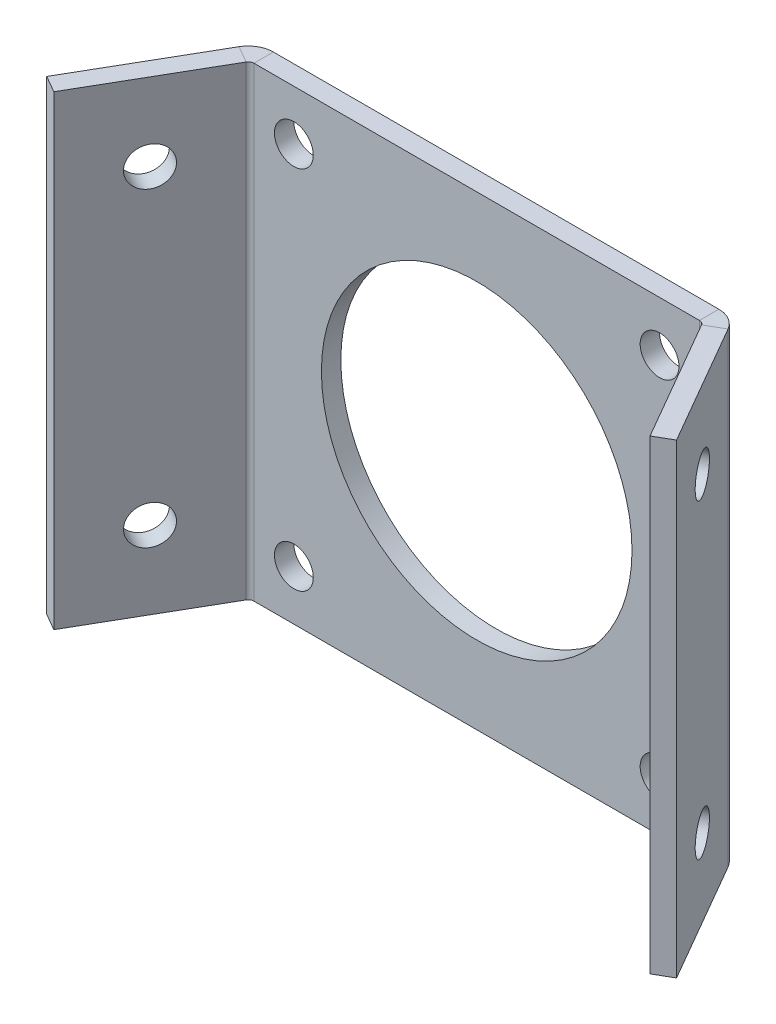
ISO-10303-21;
HEADER;
FILE_DESCRIPTION(('STEP AP214'),'2;1');
FILE_NAME('part.step','',(''),(''),'','','');
FILE_SCHEMA(('AUTOMOTIVE_DESIGN { 1 0 10303 214 1 1 1 1 }'));
ENDSEC;
DATA;
#1=APPLICATION_CONTEXT('core data for automotive mechanical design processes');
#2=APPLICATION_PROTOCOL_DEFINITION('international standard','automotive_design',2000,#1);
#3=PRODUCT_CONTEXT('',#1,'mechanical');
#4=PRODUCT('Part','Part','',(#3));
#5=PRODUCT_RELATED_PRODUCT_CATEGORY('part','',(#4));
#6=PRODUCT_DEFINITION_FORMATION('','',#4);
#7=PRODUCT_DEFINITION_CONTEXT('part definition',#1,'design');
#8=PRODUCT_DEFINITION('design','',#6,#7);
#9=PRODUCT_DEFINITION_SHAPE('','',#8);
#10=(LENGTH_UNIT() NAMED_UNIT(*) SI_UNIT(.MILLI.,.METRE.));
#11=(NAMED_UNIT(*) PLANE_ANGLE_UNIT() SI_UNIT($,.RADIAN.));
#12=(NAMED_UNIT(*) SI_UNIT($,.STERADIAN.) SOLID_ANGLE_UNIT());
#13=UNCERTAINTY_MEASURE_WITH_UNIT(LENGTH_MEASURE(1.E-05),#10,'distance_accuracy_value','');
#14=(GEOMETRIC_REPRESENTATION_CONTEXT(3) GLOBAL_UNCERTAINTY_ASSIGNED_CONTEXT((#13)) GLOBAL_UNIT_ASSIGNED_CONTEXT((#10,
#11,#12)) REPRESENTATION_CONTEXT('',''));
#15=CARTESIAN_POINT('',(0.,0.,0.));
#16=DIRECTION('',(0.,0.,1.));
#17=DIRECTION('',(1.,0.,0.));
#18=AXIS2_PLACEMENT_3D('',#15,#16,#17);
#19=CARTESIAN_POINT('',(0.,0.,-2.5));
#20=DIRECTION('',(0.,0.,1.));
#21=DIRECTION('',(1.,0.,0.));
#22=AXIS2_PLACEMENT_3D('',#19,#20,#21);
#23=PLANE('',#22);
#24=CARTESIAN_POINT('',(23.55,23.55,-2.5));
#25=DIRECTION('',(0.,0.,1.));
#26=DIRECTION('',(1.,0.,0.));
#27=AXIS2_PLACEMENT_3D('',#24,#25,#26);
#28=CIRCLE('',#27,2.5);
#29=CARTESIAN_POINT('',(26.05,23.55,-2.5));
#30=VERTEX_POINT('',#29);
#31=EDGE_CURVE('E336',#30,#30,#28,.T.);
#32=ORIENTED_EDGE('',*,*,#31,.T.);
#33=EDGE_LOOP('',(#32));
#34=FACE_BOUND('',#33,.T.);
#35=CARTESIAN_POINT('',(23.55,-23.55,-2.5));
#36=DIRECTION('',(0.,0.,1.));
#37=DIRECTION('',(1.,0.,0.));
#38=AXIS2_PLACEMENT_3D('',#35,#36,#37);
#39=CIRCLE('',#38,2.5);
#40=CARTESIAN_POINT('',(26.05,-23.55,-2.5));
#41=VERTEX_POINT('',#40);
#42=EDGE_CURVE('E333',#41,#41,#39,.T.);
#43=ORIENTED_EDGE('',*,*,#42,.T.);
#44=EDGE_LOOP('',(#43));
#45=FACE_BOUND('',#44,.T.);
#46=CARTESIAN_POINT('',(-23.55,-23.55,-2.5));
#47=DIRECTION('',(0.,0.,1.));
#48=DIRECTION('',(1.,0.,0.));
#49=AXIS2_PLACEMENT_3D('',#46,#47,#48);
#50=CIRCLE('',#49,2.5);
#51=CARTESIAN_POINT('',(-21.05,-23.55,-2.5));
#52=VERTEX_POINT('',#51);
#53=EDGE_CURVE('E330',#52,#52,#50,.T.);
#54=ORIENTED_EDGE('',*,*,#53,.T.);
#55=EDGE_LOOP('',(#54));
#56=FACE_BOUND('',#55,.T.);
#57=CARTESIAN_POINT('',(0.,0.,-2.5));
#58=DIRECTION('',(0.,0.,1.));
#59=DIRECTION('',(1.,0.,0.));
#60=AXIS2_PLACEMENT_3D('',#57,#58,#59);
#61=CIRCLE('',#60,20.);
#62=CARTESIAN_POINT('',(20.,0.,-2.5));
#63=VERTEX_POINT('',#62);
#64=EDGE_CURVE('E319',#63,#63,#61,.T.);
#65=ORIENTED_EDGE('',*,*,#64,.T.);
#66=EDGE_LOOP('',(#65));
#67=FACE_BOUND('',#66,.T.);
#68=CARTESIAN_POINT('',(-23.55,23.55,-2.5));
#69=DIRECTION('',(0.,0.,1.));
#70=DIRECTION('',(1.,0.,0.));
#71=AXIS2_PLACEMENT_3D('',#68,#69,#70);
#72=CIRCLE('',#71,2.5);
#73=CARTESIAN_POINT('',(-21.05,23.55,-2.5));
#74=VERTEX_POINT('',#73);
#75=EDGE_CURVE('E211',#74,#74,#72,.T.);
#76=ORIENTED_EDGE('',*,*,#75,.T.);
#77=EDGE_LOOP('',(#76));
#78=FACE_BOUND('',#77,.T.);
#79=DIRECTION('',(0.,-1.,0.));
#80=VECTOR('',#79,1.);
#81=CARTESIAN_POINT('',(-28.6879724457668,-30.,-2.5));
#82=LINE('',#81,#80);
#83=CARTESIAN_POINT('',(-28.6879724457668,-30.,-2.5));
#84=VERTEX_POINT('',#83);
#85=CARTESIAN_POINT('',(-28.6879724457668,30.,-2.5));
#86=VERTEX_POINT('',#85);
#87=EDGE_CURVE('E212',#84,#86,#82,.F.);
#88=ORIENTED_EDGE('',*,*,#87,.T.);
#89=DIRECTION('',(-1.,0.,0.));
#90=VECTOR('',#89,1.);
#91=CARTESIAN_POINT('',(-32.,30.,-2.5));
#92=LINE('',#91,#90);
#93=CARTESIAN_POINT('',(28.6879724457668,30.,-2.5));
#94=VERTEX_POINT('',#93);
#95=EDGE_CURVE('E88',#94,#86,#92,.T.);
#96=ORIENTED_EDGE('',*,*,#95,.F.);
#97=DIRECTION('',(0.,1.,0.));
#98=VECTOR('',#97,1.);
#99=CARTESIAN_POINT('',(28.6879724457668,30.,-2.5));
#100=LINE('',#99,#98);
#101=CARTESIAN_POINT('',(28.6879724457668,-30.,-2.5));
#102=VERTEX_POINT('',#101);
#103=EDGE_CURVE('E265',#94,#102,#100,.F.);
#104=ORIENTED_EDGE('',*,*,#103,.T.);
#105=DIRECTION('',(1.,0.,0.));
#106=VECTOR('',#105,1.);
#107=CARTESIAN_POINT('',(-32.,-30.,-2.5));
#108=LINE('',#107,#106);
#109=EDGE_CURVE('E13',#84,#102,#108,.T.);
#110=ORIENTED_EDGE('',*,*,#109,.F.);
#111=EDGE_LOOP('',(#88,#96,#104,#110));
#112=FACE_BOUND('',#111,.T.);
#113=ADVANCED_FACE('F79',(#34,#45,#56,#67,#78,#112),#23,.F.);
#114=CARTESIAN_POINT('',(0.,0.,0.));
#115=DIRECTION('',(0.,0.,1.));
#116=DIRECTION('',(1.,0.,0.));
#117=AXIS2_PLACEMENT_3D('',#114,#115,#116);
#118=PLANE('',#117);
#119=CARTESIAN_POINT('',(23.55,23.55,0.));
#120=DIRECTION('',(0.,0.,1.));
#121=DIRECTION('',(1.,0.,0.));
#122=AXIS2_PLACEMENT_3D('',#119,#120,#121);
#123=CIRCLE('',#122,2.5);
#124=CARTESIAN_POINT('',(26.05,23.55,0.));
#125=VERTEX_POINT('',#124);
#126=EDGE_CURVE('E316',#125,#125,#123,.T.);
#127=ORIENTED_EDGE('',*,*,#126,.F.);
#128=EDGE_LOOP('',(#127));
#129=FACE_BOUND('',#128,.T.);
#130=CARTESIAN_POINT('',(23.55,-23.55,0.));
#131=DIRECTION('',(0.,0.,1.));
#132=DIRECTION('',(1.,0.,0.));
#133=AXIS2_PLACEMENT_3D('',#130,#131,#132);
#134=CIRCLE('',#133,2.5);
#135=CARTESIAN_POINT('',(26.05,-23.55,0.));
#136=VERTEX_POINT('',#135);
#137=EDGE_CURVE('E320',#136,#136,#134,.T.);
#138=ORIENTED_EDGE('',*,*,#137,.F.);
#139=EDGE_LOOP('',(#138));
#140=FACE_BOUND('',#139,.T.);
#141=CARTESIAN_POINT('',(-23.55,-23.55,0.));
#142=DIRECTION('',(0.,0.,1.));
#143=DIRECTION('',(1.,0.,0.));
#144=AXIS2_PLACEMENT_3D('',#141,#142,#143);
#145=CIRCLE('',#144,2.5);
#146=CARTESIAN_POINT('',(-21.05,-23.55,0.));
#147=VERTEX_POINT('',#146);
#148=EDGE_CURVE('E323',#147,#147,#145,.T.);
#149=ORIENTED_EDGE('',*,*,#148,.F.);
#150=EDGE_LOOP('',(#149));
#151=FACE_BOUND('',#150,.T.);
#152=CARTESIAN_POINT('',(0.,0.,0.));
#153=DIRECTION('',(0.,0.,1.));
#154=DIRECTION('',(1.,0.,0.));
#155=AXIS2_PLACEMENT_3D('',#152,#153,#154);
#156=CIRCLE('',#155,20.);
#157=CARTESIAN_POINT('',(20.,0.,0.));
#158=VERTEX_POINT('',#157);
#159=EDGE_CURVE('E294',#158,#158,#156,.T.);
#160=ORIENTED_EDGE('',*,*,#159,.F.);
#161=EDGE_LOOP('',(#160));
#162=FACE_BOUND('',#161,.T.);
#163=CARTESIAN_POINT('',(-23.55,23.55,0.));
#164=DIRECTION('',(0.,0.,1.));
#165=DIRECTION('',(1.,0.,0.));
#166=AXIS2_PLACEMENT_3D('',#163,#164,#165);
#167=CIRCLE('',#166,2.5);
#168=CARTESIAN_POINT('',(-21.05,23.55,0.));
#169=VERTEX_POINT('',#168);
#170=EDGE_CURVE('E339',#169,#169,#167,.T.);
#171=ORIENTED_EDGE('',*,*,#170,.F.);
#172=EDGE_LOOP('',(#171));
#173=FACE_BOUND('',#172,.T.);
#174=DIRECTION('',(-1.,0.,0.));
#175=VECTOR('',#174,1.);
#176=CARTESIAN_POINT('',(-32.,30.,0.));
#177=LINE('',#176,#175);
#178=CARTESIAN_POINT('',(28.6879724457668,30.,0.));
#179=VERTEX_POINT('',#178);
#180=CARTESIAN_POINT('',(-28.6879724457668,30.,0.));
#181=VERTEX_POINT('',#180);
#182=EDGE_CURVE('E283',#179,#181,#177,.T.);
#183=ORIENTED_EDGE('',*,*,#182,.T.);
#184=DIRECTION('',(0.,-1.,0.));
#185=VECTOR('',#184,1.);
#186=CARTESIAN_POINT('',(-28.6879724457668,-30.,0.));
#187=LINE('',#186,#185);
#188=CARTESIAN_POINT('',(-28.6879724457668,-30.,0.));
#189=VERTEX_POINT('',#188);
#190=EDGE_CURVE('E224',#189,#181,#187,.F.);
#191=ORIENTED_EDGE('',*,*,#190,.F.);
#192=DIRECTION('',(1.,0.,0.));
#193=VECTOR('',#192,1.);
#194=CARTESIAN_POINT('',(-32.,-30.,0.));
#195=LINE('',#194,#193);
#196=CARTESIAN_POINT('',(28.6879724457668,-30.,0.));
#197=VERTEX_POINT('',#196);
#198=EDGE_CURVE('E287',#189,#197,#195,.T.);
#199=ORIENTED_EDGE('',*,*,#198,.T.);
#200=DIRECTION('',(0.,1.,0.));
#201=VECTOR('',#200,1.);
#202=CARTESIAN_POINT('',(28.6879724457668,30.,0.));
#203=LINE('',#202,#201);
#204=EDGE_CURVE('E96',#179,#197,#203,.F.);
#205=ORIENTED_EDGE('',*,*,#204,.F.);
#206=EDGE_LOOP('',(#183,#191,#199,#205));
#207=FACE_BOUND('',#206,.T.);
#208=ADVANCED_FACE('F369',(#129,#140,#151,#162,#173,#207),#118,.T.);
#209=CARTESIAN_POINT('',(-32.,-30.,-2.5));
#210=DIRECTION('',(0.,-1.,0.));
#211=DIRECTION('',(0.,0.,-1.));
#212=AXIS2_PLACEMENT_3D('',#209,#210,#211);
#213=PLANE('',#212);
#214=ORIENTED_EDGE('',*,*,#198,.F.);
#215=DIRECTION('',(0.,0.,-1.));
#216=VECTOR('',#215,1.);
#217=CARTESIAN_POINT('',(-28.6879724457668,-30.,0.));
#218=LINE('',#217,#216);
#219=EDGE_CURVE('E218',#189,#84,#218,.T.);
#220=ORIENTED_EDGE('',*,*,#219,.T.);
#221=ORIENTED_EDGE('',*,*,#109,.T.);
#222=DIRECTION('',(0.,0.,-1.));
#223=VECTOR('',#222,1.);
#224=CARTESIAN_POINT('',(28.6879724457668,-30.,0.));
#225=LINE('',#224,#223);
#226=EDGE_CURVE('E280',#197,#102,#225,.T.);
#227=ORIENTED_EDGE('',*,*,#226,.F.);
#228=EDGE_LOOP('',(#214,#220,#221,#227));
#229=FACE_BOUND('',#228,.T.);
#230=ADVANCED_FACE('F375',(#229),#213,.T.);
#231=CARTESIAN_POINT('',(-32.,30.,-2.5));
#232=DIRECTION('',(0.,1.,0.));
#233=DIRECTION('',(0.,0.,1.));
#234=AXIS2_PLACEMENT_3D('',#231,#232,#233);
#235=PLANE('',#234);
#236=DIRECTION('',(0.,0.,-1.));
#237=VECTOR('',#236,1.);
#238=CARTESIAN_POINT('',(-28.6879724457668,30.,0.));
#239=LINE('',#238,#237);
#240=EDGE_CURVE('E230',#181,#86,#239,.T.);
#241=ORIENTED_EDGE('',*,*,#240,.F.);
#242=ORIENTED_EDGE('',*,*,#182,.F.);
#243=DIRECTION('',(0.,0.,-1.));
#244=VECTOR('',#243,1.);
#245=CARTESIAN_POINT('',(28.6879724457668,30.,0.));
#246=LINE('',#245,#244);
#247=EDGE_CURVE('E271',#179,#94,#246,.T.);
#248=ORIENTED_EDGE('',*,*,#247,.T.);
#249=ORIENTED_EDGE('',*,*,#95,.T.);
#250=EDGE_LOOP('',(#241,#242,#248,#249));
#251=FACE_BOUND('',#250,.T.);
#252=ADVANCED_FACE('F81',(#251),#235,.T.);
#253=CARTESIAN_POINT('',(28.6879724457668,-30.,0.736599999999997));
#254=DIRECTION('',(0.,-1.,0.));
#255=DIRECTION('',(0.,0.,-1.));
#256=AXIS2_PLACEMENT_3D('',#253,#254,#255);
#257=PLANE('',#256);
#258=DIRECTION('',(-0.866025403784436,0.,0.500000000000004));
#259=VECTOR('',#258,1.);
#260=CARTESIAN_POINT('',(31.4909502676555,-30.,-0.881700000000009));
#261=LINE('',#260,#259);
#262=CARTESIAN_POINT('',(29.3258867581944,-30.,0.368299999999995));
#263=VERTEX_POINT('',#262);
#264=CARTESIAN_POINT('',(31.4909502676555,-30.,-0.881700000000012));
#265=VERTEX_POINT('',#264);
#266=EDGE_CURVE('E233',#263,#265,#261,.F.);
#267=ORIENTED_EDGE('',*,*,#266,.F.);
#268=CARTESIAN_POINT('',(28.6879724457668,-30.,0.736599999999997));
#269=DIRECTION('',(0.,1.,0.));
#270=DIRECTION('',(0.,0.,1.));
#271=AXIS2_PLACEMENT_3D('',#268,#269,#270);
#272=CIRCLE('',#271,0.736599999999998);
#273=EDGE_CURVE('E274',#197,#263,#272,.F.);
#274=ORIENTED_EDGE('',*,*,#273,.F.);
#275=ORIENTED_EDGE('',*,*,#226,.T.);
#276=CARTESIAN_POINT('',(28.6879724457668,-30.,0.736599999999997));
#277=DIRECTION('',(0.,1.,0.));
#278=DIRECTION('',(0.,0.,1.));
#279=AXIS2_PLACEMENT_3D('',#276,#277,#278);
#280=CIRCLE('',#279,3.2366);
#281=EDGE_CURVE('E267',#102,#265,#280,.F.);
#282=ORIENTED_EDGE('',*,*,#281,.T.);
#283=EDGE_LOOP('',(#267,#274,#275,#282));
#284=FACE_BOUND('',#283,.T.);
#285=ADVANCED_FACE('F386',(#284),#257,.T.);
#286=CARTESIAN_POINT('',(28.6879724457668,30.,0.736599999999997));
#287=DIRECTION('',(0.,-1.,0.));
#288=DIRECTION('',(0.,0.,-1.));
#289=AXIS2_PLACEMENT_3D('',#286,#287,#288);
#290=PLANE('',#289);
#291=CARTESIAN_POINT('',(28.6879724457668,30.,0.736599999999997));
#292=DIRECTION('',(0.,1.,0.));
#293=DIRECTION('',(0.,0.,1.));
#294=AXIS2_PLACEMENT_3D('',#291,#292,#293);
#295=CIRCLE('',#294,0.736599999999998);
#296=CARTESIAN_POINT('',(29.3258867581944,30.,0.368299999999995));
#297=VERTEX_POINT('',#296);
#298=EDGE_CURVE('E238',#297,#179,#295,.T.);
#299=ORIENTED_EDGE('',*,*,#298,.F.);
#300=DIRECTION('',(-0.866025403784436,0.,0.500000000000004));
#301=VECTOR('',#300,1.);
#302=CARTESIAN_POINT('',(29.3258867581944,30.,0.368300000000002));
#303=LINE('',#302,#301);
#304=CARTESIAN_POINT('',(31.4909502676555,30.,-0.881700000000016));
#305=VERTEX_POINT('',#304);
#306=EDGE_CURVE('E258',#297,#305,#303,.F.);
#307=ORIENTED_EDGE('',*,*,#306,.T.);
#308=CARTESIAN_POINT('',(28.6879724457668,30.,0.736599999999997));
#309=DIRECTION('',(0.,1.,0.));
#310=DIRECTION('',(0.,0.,1.));
#311=AXIS2_PLACEMENT_3D('',#308,#309,#310);
#312=CIRCLE('',#311,3.2366);
#313=EDGE_CURVE('E268',#305,#94,#312,.T.);
#314=ORIENTED_EDGE('',*,*,#313,.T.);
#315=ORIENTED_EDGE('',*,*,#247,.F.);
#316=EDGE_LOOP('',(#299,#307,#314,#315));
#317=FACE_BOUND('',#316,.T.);
#318=ADVANCED_FACE('F380',(#317),#290,.F.);
#319=CARTESIAN_POINT('',(28.6879724457668,30.,0.736599999999997));
#320=DIRECTION('',(0.,1.,0.));
#321=DIRECTION('',(0.866025403784436,0.,-0.500000000000004));
#322=AXIS2_PLACEMENT_3D('',#319,#320,#321);
#323=CYLINDRICAL_SURFACE('',#322,3.2366);
#324=ORIENTED_EDGE('',*,*,#103,.F.);
#325=ORIENTED_EDGE('',*,*,#313,.F.);
#326=DIRECTION('',(0.,1.,0.));
#327=VECTOR('',#326,1.);
#328=CARTESIAN_POINT('',(31.4909502676555,-30.,-0.881700000000015));
#329=LINE('',#328,#327);
#330=EDGE_CURVE('E256',#305,#265,#329,.F.);
#331=ORIENTED_EDGE('',*,*,#330,.T.);
#332=ORIENTED_EDGE('',*,*,#281,.F.);
#333=EDGE_LOOP('',(#324,#325,#331,#332));
#334=FACE_BOUND('',#333,.T.);
#335=ADVANCED_FACE('F402',(#334),#323,.T.);
#336=CARTESIAN_POINT('',(28.6879724457668,30.,0.736599999999997));
#337=DIRECTION('',(0.,1.,0.));
#338=DIRECTION('',(0.866025403784436,0.,-0.500000000000004));
#339=AXIS2_PLACEMENT_3D('',#336,#337,#338);
#340=CYLINDRICAL_SURFACE('',#339,0.736599999999998);
#341=ORIENTED_EDGE('',*,*,#204,.T.);
#342=ORIENTED_EDGE('',*,*,#273,.T.);
#343=DIRECTION('',(0.,1.,0.));
#344=VECTOR('',#343,1.);
#345=CARTESIAN_POINT('',(29.3258867581944,-30.,0.368299999999996));
#346=LINE('',#345,#344);
#347=EDGE_CURVE('E261',#263,#297,#346,.T.);
#348=ORIENTED_EDGE('',*,*,#347,.T.);
#349=ORIENTED_EDGE('',*,*,#298,.T.);
#350=EDGE_LOOP('',(#341,#342,#348,#349));
#351=FACE_BOUND('',#350,.T.);
#352=ADVANCED_FACE('F425',(#351),#340,.F.);
#353=CARTESIAN_POINT('',(31.278312163513,-30.,-1.25000000000001));
#354=DIRECTION('',(0.,1.,0.));
#355=DIRECTION('',(0.,0.,1.));
#356=AXIS2_PLACEMENT_3D('',#353,#354,#355);
#357=PLANE('',#356);
#358=ORIENTED_EDGE('',*,*,#266,.T.);
#359=DIRECTION('',(-0.500000000000004,0.,-0.866025403784436));
#360=VECTOR('',#359,1.);
#361=CARTESIAN_POINT('',(23.2783121635128,-30.,-15.1064064605511));
#362=LINE('',#361,#360);
#363=CARTESIAN_POINT('',(40.556624327026,-30.,14.8205080756887));
#364=VERTEX_POINT('',#363);
#365=EDGE_CURVE('E246',#364,#265,#362,.T.);
#366=ORIENTED_EDGE('',*,*,#365,.F.);
#367=DIRECTION('',(-0.866025403784436,0.,0.500000000000004));
#368=VECTOR('',#367,1.);
#369=CARTESIAN_POINT('',(40.556624327026,-30.,14.8205080756887));
#370=LINE('',#369,#368);
#371=CARTESIAN_POINT('',(38.3915608175649,-30.,16.0705080756887));
#372=VERTEX_POINT('',#371);
#373=EDGE_CURVE('E239',#364,#372,#370,.T.);
#374=ORIENTED_EDGE('',*,*,#373,.T.);
#375=DIRECTION('',(0.500000000000004,0.,0.866025403784436));
#376=VECTOR('',#375,1.);
#377=CARTESIAN_POINT('',(29.1132486540519,-30.,0.));
#378=LINE('',#377,#376);
#379=EDGE_CURVE('E253',#372,#263,#378,.F.);
#380=ORIENTED_EDGE('',*,*,#379,.T.);
#381=EDGE_LOOP('',(#358,#366,#374,#380));
#382=FACE_BOUND('',#381,.T.);
#383=ADVANCED_FACE('F420',(#382),#357,.F.);
#384=CARTESIAN_POINT('',(40.556624327026,30.,14.8205080756887));
#385=DIRECTION('',(0.,-1.,0.));
#386=DIRECTION('',(0.,0.,-1.));
#387=AXIS2_PLACEMENT_3D('',#384,#385,#386);
#388=PLANE('',#387);
#389=ORIENTED_EDGE('',*,*,#306,.F.);
#390=DIRECTION('',(-0.500000000000004,0.,-0.866025403784436));
#391=VECTOR('',#390,1.);
#392=CARTESIAN_POINT('',(38.3915608175649,30.,16.0705080756887));
#393=LINE('',#392,#391);
#394=CARTESIAN_POINT('',(38.3915608175649,30.,16.0705080756887));
#395=VERTEX_POINT('',#394);
#396=EDGE_CURVE('E251',#297,#395,#393,.F.);
#397=ORIENTED_EDGE('',*,*,#396,.T.);
#398=DIRECTION('',(-0.866025403784436,0.,0.500000000000004));
#399=VECTOR('',#398,1.);
#400=CARTESIAN_POINT('',(40.556624327026,30.,14.8205080756887));
#401=LINE('',#400,#399);
#402=CARTESIAN_POINT('',(40.556624327026,30.,14.8205080756887));
#403=VERTEX_POINT('',#402);
#404=EDGE_CURVE('E235',#403,#395,#401,.T.);
#405=ORIENTED_EDGE('',*,*,#404,.F.);
#406=DIRECTION('',(0.500000000000004,0.,0.866025403784436));
#407=VECTOR('',#406,1.);
#408=CARTESIAN_POINT('',(23.2783121635129,30.,-15.1064064605511));
#409=LINE('',#408,#407);
#410=EDGE_CURVE('E244',#305,#403,#409,.T.);
#411=ORIENTED_EDGE('',*,*,#410,.F.);
#412=EDGE_LOOP('',(#389,#397,#405,#411));
#413=FACE_BOUND('',#412,.T.);
#414=ADVANCED_FACE('F412',(#413),#388,.F.);
#415=CARTESIAN_POINT('',(23.2783121635128,0.,-15.1064064605511));
#416=DIRECTION('',(-0.866025403784436,0.,0.500000000000004));
#417=DIRECTION('',(0.500000000000004,0.,0.866025403784436));
#418=AXIS2_PLACEMENT_3D('',#415,#416,#417);
#419=PLANE('',#418);
#420=CARTESIAN_POINT('',(36.0237872973408,-20.,6.96940403784434));
#421=DIRECTION('',(-0.866025403784436,0.,0.500000000000004));
#422=DIRECTION('',(-0.500000000000004,0.,-0.866025403784436));
#423=AXIS2_PLACEMENT_3D('',#420,#421,#422);
#424=CIRCLE('',#423,2.5);
#425=CARTESIAN_POINT('',(34.7737872973408,-20.,4.80434052838325));
#426=VERTEX_POINT('',#425);
#427=EDGE_CURVE('E311',#426,#426,#424,.T.);
#428=ORIENTED_EDGE('',*,*,#427,.T.);
#429=EDGE_LOOP('',(#428));
#430=FACE_BOUND('',#429,.T.);
#431=CARTESIAN_POINT('',(36.0237872973408,20.,6.96940403784434));
#432=DIRECTION('',(-0.866025403784436,0.,0.500000000000004));
#433=DIRECTION('',(0.500000000000004,0.,0.866025403784436));
#434=AXIS2_PLACEMENT_3D('',#431,#432,#433);
#435=CIRCLE('',#434,2.49999999999999);
#436=CARTESIAN_POINT('',(37.2737872973408,20.,9.13446754730543));
#437=VERTEX_POINT('',#436);
#438=EDGE_CURVE('E301',#437,#437,#435,.T.);
#439=ORIENTED_EDGE('',*,*,#438,.T.);
#440=EDGE_LOOP('',(#439));
#441=FACE_BOUND('',#440,.T.);
#442=ORIENTED_EDGE('',*,*,#330,.F.);
#443=ORIENTED_EDGE('',*,*,#410,.T.);
#444=DIRECTION('',(0.,-1.,0.));
#445=VECTOR('',#444,1.);
#446=CARTESIAN_POINT('',(40.556624327026,0.,14.8205080756887));
#447=LINE('',#446,#445);
#448=EDGE_CURVE('E242',#403,#364,#447,.T.);
#449=ORIENTED_EDGE('',*,*,#448,.T.);
#450=ORIENTED_EDGE('',*,*,#365,.T.);
#451=EDGE_LOOP('',(#442,#443,#449,#450));
#452=FACE_BOUND('',#451,.T.);
#453=ADVANCED_FACE('F409',(#430,#441,#452),#419,.F.);
#454=CARTESIAN_POINT('',(21.1132486540517,0.,-13.8564064605511));
#455=DIRECTION('',(-0.866025403784436,0.,0.500000000000004));
#456=DIRECTION('',(0.500000000000004,0.,0.866025403784436));
#457=AXIS2_PLACEMENT_3D('',#454,#455,#456);
#458=PLANE('',#457);
#459=CARTESIAN_POINT('',(33.8587237878797,-20.,8.21940403784437));
#460=DIRECTION('',(-0.866025403784436,0.,0.500000000000004));
#461=DIRECTION('',(0.500000000000004,0.,0.866025403784436));
#462=AXIS2_PLACEMENT_3D('',#459,#460,#461);
#463=CIRCLE('',#462,2.5);
#464=CARTESIAN_POINT('',(35.1087237878797,-20.,10.3844675473055));
#465=VERTEX_POINT('',#464);
#466=EDGE_CURVE('E83',#465,#465,#463,.F.);
#467=ORIENTED_EDGE('',*,*,#466,.T.);
#468=EDGE_LOOP('',(#467));
#469=FACE_BOUND('',#468,.T.);
#470=CARTESIAN_POINT('',(33.8587237878797,20.,8.21940403784437));
#471=DIRECTION('',(-0.866025403784436,0.,0.500000000000004));
#472=DIRECTION('',(0.500000000000004,0.,0.866025403784436));
#473=AXIS2_PLACEMENT_3D('',#470,#471,#472);
#474=CIRCLE('',#473,2.49999999999999);
#475=CARTESIAN_POINT('',(35.1087237878797,20.,10.3844675473055));
#476=VERTEX_POINT('',#475);
#477=EDGE_CURVE('E299',#476,#476,#474,.F.);
#478=ORIENTED_EDGE('',*,*,#477,.T.);
#479=EDGE_LOOP('',(#478));
#480=FACE_BOUND('',#479,.T.);
#481=ORIENTED_EDGE('',*,*,#396,.F.);
#482=ORIENTED_EDGE('',*,*,#347,.F.);
#483=ORIENTED_EDGE('',*,*,#379,.F.);
#484=DIRECTION('',(0.,1.,0.));
#485=VECTOR('',#484,1.);
#486=CARTESIAN_POINT('',(38.3915608175649,-30.,16.0705080756887));
#487=LINE('',#486,#485);
#488=EDGE_CURVE('E249',#395,#372,#487,.F.);
#489=ORIENTED_EDGE('',*,*,#488,.F.);
#490=EDGE_LOOP('',(#481,#482,#483,#489));
#491=FACE_BOUND('',#490,.T.);
#492=ADVANCED_FACE('F427',(#469,#480,#491),#458,.T.);
#493=CARTESIAN_POINT('',(40.556624327026,-30.,14.8205080756887));
#494=DIRECTION('',(-0.500000000000004,0.,-0.866025403784436));
#495=DIRECTION('',(-0.866025403784436,0.,0.500000000000004));
#496=AXIS2_PLACEMENT_3D('',#493,#494,#495);
#497=PLANE('',#496);
#498=ORIENTED_EDGE('',*,*,#488,.T.);
#499=ORIENTED_EDGE('',*,*,#373,.F.);
#500=ORIENTED_EDGE('',*,*,#448,.F.);
#501=ORIENTED_EDGE('',*,*,#404,.T.);
#502=EDGE_LOOP('',(#498,#499,#500,#501));
#503=FACE_BOUND('',#502,.T.);
#504=ADVANCED_FACE('F417',(#503),#497,.F.);
#505=CARTESIAN_POINT('',(-28.6879724457668,30.,0.736599999999997));
#506=DIRECTION('',(0.,1.,0.));
#507=DIRECTION('',(0.,0.,1.));
#508=AXIS2_PLACEMENT_3D('',#505,#506,#507);
#509=PLANE('',#508);
#510=DIRECTION('',(0.866025403784436,0.,0.500000000000004));
#511=VECTOR('',#510,1.);
#512=CARTESIAN_POINT('',(-31.4909502676555,30.,-0.881700000000009));
#513=LINE('',#512,#511);
#514=CARTESIAN_POINT('',(-29.3258867581944,30.,0.368299999999995));
#515=VERTEX_POINT('',#514);
#516=CARTESIAN_POINT('',(-31.4909502676555,30.,-0.881700000000012));
#517=VERTEX_POINT('',#516);
#518=EDGE_CURVE('E194',#515,#517,#513,.F.);
#519=ORIENTED_EDGE('',*,*,#518,.F.);
#520=CARTESIAN_POINT('',(-28.6879724457668,30.,0.736599999999997));
#521=DIRECTION('',(0.,-1.,0.));
#522=DIRECTION('',(0.,0.,-1.));
#523=AXIS2_PLACEMENT_3D('',#520,#521,#522);
#524=CIRCLE('',#523,0.736599999999998);
#525=EDGE_CURVE('E221',#181,#515,#524,.F.);
#526=ORIENTED_EDGE('',*,*,#525,.F.);
#527=ORIENTED_EDGE('',*,*,#240,.T.);
#528=CARTESIAN_POINT('',(-28.6879724457668,30.,0.736599999999997));
#529=DIRECTION('',(0.,-1.,0.));
#530=DIRECTION('',(0.,0.,-1.));
#531=AXIS2_PLACEMENT_3D('',#528,#529,#530);
#532=CIRCLE('',#531,3.2366);
#533=EDGE_CURVE('E214',#86,#517,#532,.F.);
#534=ORIENTED_EDGE('',*,*,#533,.T.);
#535=EDGE_LOOP('',(#519,#526,#527,#534));
#536=FACE_BOUND('',#535,.T.);
#537=ADVANCED_FACE('F391',(#536),#509,.T.);
#538=CARTESIAN_POINT('',(-28.6879724457668,-30.,0.736599999999997));
#539=DIRECTION('',(0.,1.,0.));
#540=DIRECTION('',(0.,0.,1.));
#541=AXIS2_PLACEMENT_3D('',#538,#539,#540);
#542=PLANE('',#541);
#543=CARTESIAN_POINT('',(-28.6879724457668,-30.,0.736599999999997));
#544=DIRECTION('',(0.,-1.,0.));
#545=DIRECTION('',(0.,0.,-1.));
#546=AXIS2_PLACEMENT_3D('',#543,#544,#545);
#547=CIRCLE('',#546,0.736599999999998);
#548=CARTESIAN_POINT('',(-29.3258867581944,-30.,0.368299999999995));
#549=VERTEX_POINT('',#548);
#550=EDGE_CURVE('E227',#549,#189,#547,.T.);
#551=ORIENTED_EDGE('',*,*,#550,.F.);
#552=DIRECTION('',(0.866025403784436,0.,0.500000000000004));
#553=VECTOR('',#552,1.);
#554=CARTESIAN_POINT('',(-29.3258867581944,-30.,0.368300000000002));
#555=LINE('',#554,#553);
#556=CARTESIAN_POINT('',(-31.4909502676555,-30.,-0.881700000000015));
#557=VERTEX_POINT('',#556);
#558=EDGE_CURVE('E205',#549,#557,#555,.F.);
#559=ORIENTED_EDGE('',*,*,#558,.T.);
#560=CARTESIAN_POINT('',(-28.6879724457668,-30.,0.736599999999997));
#561=DIRECTION('',(0.,-1.,0.));
#562=DIRECTION('',(0.,0.,-1.));
#563=AXIS2_PLACEMENT_3D('',#560,#561,#562);
#564=CIRCLE('',#563,3.2366);
#565=EDGE_CURVE('E215',#557,#84,#564,.T.);
#566=ORIENTED_EDGE('',*,*,#565,.T.);
#567=ORIENTED_EDGE('',*,*,#219,.F.);
#568=EDGE_LOOP('',(#551,#559,#566,#567));
#569=FACE_BOUND('',#568,.T.);
#570=ADVANCED_FACE('F356',(#569),#542,.F.);
#571=CARTESIAN_POINT('',(-28.6879724457668,-30.,0.736599999999997));
#572=DIRECTION('',(0.,-1.,0.));
#573=DIRECTION('',(-0.866025403784436,0.,-0.500000000000004));
#574=AXIS2_PLACEMENT_3D('',#571,#572,#573);
#575=CYLINDRICAL_SURFACE('',#574,3.2366);
#576=ORIENTED_EDGE('',*,*,#87,.F.);
#577=ORIENTED_EDGE('',*,*,#565,.F.);
#578=DIRECTION('',(0.,-1.,0.));
#579=VECTOR('',#578,1.);
#580=CARTESIAN_POINT('',(-31.4909502676555,30.,-0.881700000000015));
#581=LINE('',#580,#579);
#582=EDGE_CURVE('E203',#557,#517,#581,.F.);
#583=ORIENTED_EDGE('',*,*,#582,.T.);
#584=ORIENTED_EDGE('',*,*,#533,.F.);
#585=EDGE_LOOP('',(#576,#577,#583,#584));
#586=FACE_BOUND('',#585,.T.);
#587=ADVANCED_FACE('F394',(#586),#575,.T.);
#588=CARTESIAN_POINT('',(-28.6879724457668,-30.,0.736599999999997));
#589=DIRECTION('',(0.,-1.,0.));
#590=DIRECTION('',(-0.866025403784436,0.,-0.500000000000004));
#591=AXIS2_PLACEMENT_3D('',#588,#589,#590);
#592=CYLINDRICAL_SURFACE('',#591,0.736599999999998);
#593=ORIENTED_EDGE('',*,*,#190,.T.);
#594=ORIENTED_EDGE('',*,*,#525,.T.);
#595=DIRECTION('',(0.,-1.,0.));
#596=VECTOR('',#595,1.);
#597=CARTESIAN_POINT('',(-29.3258867581944,30.,0.368299999999996));
#598=LINE('',#597,#596);
#599=EDGE_CURVE('E208',#515,#549,#598,.T.);
#600=ORIENTED_EDGE('',*,*,#599,.T.);
#601=ORIENTED_EDGE('',*,*,#550,.T.);
#602=EDGE_LOOP('',(#593,#594,#600,#601));
#603=FACE_BOUND('',#602,.T.);
#604=ADVANCED_FACE('F351',(#603),#592,.F.);
#605=CARTESIAN_POINT('',(-31.278312163513,30.,-1.25000000000001));
#606=DIRECTION('',(0.,-1.,0.));
#607=DIRECTION('',(0.,0.,-1.));
#608=AXIS2_PLACEMENT_3D('',#605,#606,#607);
#609=PLANE('',#608);
#610=ORIENTED_EDGE('',*,*,#518,.T.);
#611=DIRECTION('',(0.500000000000004,0.,-0.866025403784436));
#612=VECTOR('',#611,1.);
#613=CARTESIAN_POINT('',(-23.2783121635128,30.,-15.1064064605511));
#614=LINE('',#613,#612);
#615=CARTESIAN_POINT('',(-40.556624327026,30.,14.8205080756887));
#616=VERTEX_POINT('',#615);
#617=EDGE_CURVE('E175',#616,#517,#614,.T.);
#618=ORIENTED_EDGE('',*,*,#617,.F.);
#619=DIRECTION('',(0.866025403784436,0.,0.500000000000004));
#620=VECTOR('',#619,1.);
#621=CARTESIAN_POINT('',(-40.556624327026,30.,14.8205080756887));
#622=LINE('',#621,#620);
#623=CARTESIAN_POINT('',(-38.3915608175649,30.,16.0705080756887));
#624=VERTEX_POINT('',#623);
#625=EDGE_CURVE('E181',#616,#624,#622,.T.);
#626=ORIENTED_EDGE('',*,*,#625,.T.);
#627=DIRECTION('',(-0.500000000000004,0.,0.866025403784436));
#628=VECTOR('',#627,1.);
#629=CARTESIAN_POINT('',(-29.1132486540519,30.,0.));
#630=LINE('',#629,#628);
#631=EDGE_CURVE('E201',#624,#515,#630,.F.);
#632=ORIENTED_EDGE('',*,*,#631,.T.);
#633=EDGE_LOOP('',(#610,#618,#626,#632));
#634=FACE_BOUND('',#633,.T.);
#635=ADVANCED_FACE('F193',(#634),#609,.F.);
#636=CARTESIAN_POINT('',(-40.556624327026,-30.,14.8205080756887));
#637=DIRECTION('',(0.,1.,0.));
#638=DIRECTION('',(0.,0.,1.));
#639=AXIS2_PLACEMENT_3D('',#636,#637,#638);
#640=PLANE('',#639);
#641=ORIENTED_EDGE('',*,*,#558,.F.);
#642=DIRECTION('',(0.500000000000004,0.,-0.866025403784436));
#643=VECTOR('',#642,1.);
#644=CARTESIAN_POINT('',(-38.3915608175649,-30.,16.0705080756887));
#645=LINE('',#644,#643);
#646=CARTESIAN_POINT('',(-38.3915608175649,-30.,16.0705080756887));
#647=VERTEX_POINT('',#646);
#648=EDGE_CURVE('E197',#549,#647,#645,.F.);
#649=ORIENTED_EDGE('',*,*,#648,.T.);
#650=DIRECTION('',(0.866025403784436,0.,0.500000000000004));
#651=VECTOR('',#650,1.);
#652=CARTESIAN_POINT('',(-40.556624327026,-30.,14.8205080756887));
#653=LINE('',#652,#651);
#654=CARTESIAN_POINT('',(-40.556624327026,-30.,14.8205080756887));
#655=VERTEX_POINT('',#654);
#656=EDGE_CURVE('E190',#655,#647,#653,.T.);
#657=ORIENTED_EDGE('',*,*,#656,.F.);
#658=DIRECTION('',(-0.500000000000004,0.,0.866025403784436));
#659=VECTOR('',#658,1.);
#660=CARTESIAN_POINT('',(-23.2783121635128,-30.,-15.1064064605511));
#661=LINE('',#660,#659);
#662=EDGE_CURVE('E177',#557,#655,#661,.T.);
#663=ORIENTED_EDGE('',*,*,#662,.F.);
#664=EDGE_LOOP('',(#641,#649,#657,#663));
#665=FACE_BOUND('',#664,.T.);
#666=ADVANCED_FACE('F357',(#665),#640,.F.);
#667=CARTESIAN_POINT('',(-23.2783121635128,0.,-15.1064064605511));
#668=DIRECTION('',(0.866025403784436,0.,0.500000000000004));
#669=DIRECTION('',(0.500000000000004,0.,-0.866025403784436));
#670=AXIS2_PLACEMENT_3D('',#667,#668,#669);
#671=PLANE('',#670);
#672=CARTESIAN_POINT('',(-36.0237872973408,-20.,6.96940403784434));
#673=DIRECTION('',(-0.866025403784436,0.,-0.500000000000004));
#674=DIRECTION('',(0.500000000000004,0.,-0.866025403784436));
#675=AXIS2_PLACEMENT_3D('',#672,#673,#674);
#676=CIRCLE('',#675,2.5);
#677=CARTESIAN_POINT('',(-34.7737872973408,-20.,4.80434052838325));
#678=VERTEX_POINT('',#677);
#679=EDGE_CURVE('E298',#678,#678,#676,.T.);
#680=ORIENTED_EDGE('',*,*,#679,.F.);
#681=EDGE_LOOP('',(#680));
#682=FACE_BOUND('',#681,.T.);
#683=CARTESIAN_POINT('',(-36.0237872973408,20.,6.96940403784434));
#684=DIRECTION('',(-0.866025403784436,0.,-0.500000000000004));
#685=DIRECTION('',(-0.500000000000004,0.,0.866025403784436));
#686=AXIS2_PLACEMENT_3D('',#683,#684,#685);
#687=CIRCLE('',#686,2.49999999999999);
#688=CARTESIAN_POINT('',(-37.2737872973408,20.,9.13446754730543));
#689=VERTEX_POINT('',#688);
#690=EDGE_CURVE('E295',#689,#689,#687,.T.);
#691=ORIENTED_EDGE('',*,*,#690,.F.);
#692=EDGE_LOOP('',(#691));
#693=FACE_BOUND('',#692,.T.);
#694=ORIENTED_EDGE('',*,*,#582,.F.);
#695=ORIENTED_EDGE('',*,*,#662,.T.);
#696=DIRECTION('',(0.,1.,0.));
#697=VECTOR('',#696,1.);
#698=CARTESIAN_POINT('',(-40.556624327026,0.,14.8205080756887));
#699=LINE('',#698,#697);
#700=EDGE_CURVE('E170',#655,#616,#699,.T.);
#701=ORIENTED_EDGE('',*,*,#700,.T.);
#702=ORIENTED_EDGE('',*,*,#617,.T.);
#703=EDGE_LOOP('',(#694,#695,#701,#702));
#704=FACE_BOUND('',#703,.T.);
#705=ADVANCED_FACE('F173',(#682,#693,#704),#671,.F.);
#706=CARTESIAN_POINT('',(-21.1132486540517,0.,-13.8564064605511));
#707=DIRECTION('',(0.866025403784436,0.,0.500000000000004));
#708=DIRECTION('',(0.500000000000004,0.,-0.866025403784436));
#709=AXIS2_PLACEMENT_3D('',#706,#707,#708);
#710=PLANE('',#709);
#711=CARTESIAN_POINT('',(-33.8587237878797,-20.,8.21940403784437));
#712=DIRECTION('',(0.866025403784436,0.,0.500000000000004));
#713=DIRECTION('',(0.500000000000004,0.,-0.866025403784436));
#714=AXIS2_PLACEMENT_3D('',#711,#712,#713);
#715=CIRCLE('',#714,2.5);
#716=CARTESIAN_POINT('',(-32.6087237878797,-20.,6.05434052838327));
#717=VERTEX_POINT('',#716);
#718=EDGE_CURVE('E296',#717,#717,#715,.T.);
#719=ORIENTED_EDGE('',*,*,#718,.F.);
#720=EDGE_LOOP('',(#719));
#721=FACE_BOUND('',#720,.T.);
#722=CARTESIAN_POINT('',(-33.8587237878797,20.,8.21940403784437));
#723=DIRECTION('',(0.866025403784436,0.,0.500000000000004));
#724=DIRECTION('',(0.500000000000004,0.,-0.866025403784436));
#725=AXIS2_PLACEMENT_3D('',#722,#723,#724);
#726=CIRCLE('',#725,2.49999999999999);
#727=CARTESIAN_POINT('',(-32.6087237878797,20.,6.05434052838329));
#728=VERTEX_POINT('',#727);
#729=EDGE_CURVE('E291',#728,#728,#726,.T.);
#730=ORIENTED_EDGE('',*,*,#729,.F.);
#731=EDGE_LOOP('',(#730));
#732=FACE_BOUND('',#731,.T.);
#733=ORIENTED_EDGE('',*,*,#648,.F.);
#734=ORIENTED_EDGE('',*,*,#599,.F.);
#735=ORIENTED_EDGE('',*,*,#631,.F.);
#736=DIRECTION('',(0.,-1.,0.));
#737=VECTOR('',#736,1.);
#738=CARTESIAN_POINT('',(-38.3915608175649,30.,16.0705080756887));
#739=LINE('',#738,#737);
#740=EDGE_CURVE('E186',#647,#624,#739,.F.);
#741=ORIENTED_EDGE('',*,*,#740,.F.);
#742=EDGE_LOOP('',(#733,#734,#735,#741));
#743=FACE_BOUND('',#742,.T.);
#744=ADVANCED_FACE('F347',(#721,#732,#743),#710,.T.);
#745=CARTESIAN_POINT('',(-40.556624327026,30.,14.8205080756887));
#746=DIRECTION('',(0.500000000000004,0.,-0.866025403784436));
#747=DIRECTION('',(-0.866025403784436,0.,-0.500000000000004));
#748=AXIS2_PLACEMENT_3D('',#745,#746,#747);
#749=PLANE('',#748);
#750=ORIENTED_EDGE('',*,*,#740,.T.);
#751=ORIENTED_EDGE('',*,*,#625,.F.);
#752=ORIENTED_EDGE('',*,*,#700,.F.);
#753=ORIENTED_EDGE('',*,*,#656,.T.);
#754=EDGE_LOOP('',(#750,#751,#752,#753));
#755=FACE_BOUND('',#754,.T.);
#756=ADVANCED_FACE('F184',(#755),#749,.F.);
#757=CARTESIAN_POINT('',(-23.55,23.55,-10.));
#758=DIRECTION('',(0.,0.,1.));
#759=DIRECTION('',(1.,0.,0.));
#760=AXIS2_PLACEMENT_3D('',#757,#758,#759);
#761=CYLINDRICAL_SURFACE('',#760,2.5);
#762=ORIENTED_EDGE('',*,*,#170,.T.);
#763=EDGE_LOOP('',(#762));
#764=FACE_BOUND('',#763,.T.);
#765=ORIENTED_EDGE('',*,*,#75,.F.);
#766=EDGE_LOOP('',(#765));
#767=FACE_BOUND('',#766,.T.);
#768=ADVANCED_FACE('F566',(#764,#767),#761,.F.);
#769=CARTESIAN_POINT('',(0.,0.,-10.));
#770=DIRECTION('',(0.,0.,1.));
#771=DIRECTION('',(1.,0.,0.));
#772=AXIS2_PLACEMENT_3D('',#769,#770,#771);
#773=CYLINDRICAL_SURFACE('',#772,20.);
#774=ORIENTED_EDGE('',*,*,#159,.T.);
#775=EDGE_LOOP('',(#774));
#776=FACE_BOUND('',#775,.T.);
#777=ORIENTED_EDGE('',*,*,#64,.F.);
#778=EDGE_LOOP('',(#777));
#779=FACE_BOUND('',#778,.T.);
#780=ADVANCED_FACE('F556',(#776,#779),#773,.F.);
#781=CARTESIAN_POINT('',(-23.55,-23.55,-10.));
#782=DIRECTION('',(0.,0.,1.));
#783=DIRECTION('',(1.,0.,0.));
#784=AXIS2_PLACEMENT_3D('',#781,#782,#783);
#785=CYLINDRICAL_SURFACE('',#784,2.5);
#786=ORIENTED_EDGE('',*,*,#148,.T.);
#787=EDGE_LOOP('',(#786));
#788=FACE_BOUND('',#787,.T.);
#789=ORIENTED_EDGE('',*,*,#53,.F.);
#790=EDGE_LOOP('',(#789));
#791=FACE_BOUND('',#790,.T.);
#792=ADVANCED_FACE('F546',(#788,#791),#785,.F.);
#793=CARTESIAN_POINT('',(23.55,-23.55,-10.));
#794=DIRECTION('',(0.,0.,1.));
#795=DIRECTION('',(1.,0.,0.));
#796=AXIS2_PLACEMENT_3D('',#793,#794,#795);
#797=CYLINDRICAL_SURFACE('',#796,2.5);
#798=ORIENTED_EDGE('',*,*,#137,.T.);
#799=EDGE_LOOP('',(#798));
#800=FACE_BOUND('',#799,.T.);
#801=ORIENTED_EDGE('',*,*,#42,.F.);
#802=EDGE_LOOP('',(#801));
#803=FACE_BOUND('',#802,.T.);
#804=ADVANCED_FACE('F536',(#800,#803),#797,.F.);
#805=CARTESIAN_POINT('',(23.55,23.55,-10.));
#806=DIRECTION('',(0.,0.,1.));
#807=DIRECTION('',(1.,0.,0.));
#808=AXIS2_PLACEMENT_3D('',#805,#806,#807);
#809=CYLINDRICAL_SURFACE('',#808,2.5);
#810=ORIENTED_EDGE('',*,*,#126,.T.);
#811=EDGE_LOOP('',(#810));
#812=FACE_BOUND('',#811,.T.);
#813=ORIENTED_EDGE('',*,*,#31,.F.);
#814=EDGE_LOOP('',(#813));
#815=FACE_BOUND('',#814,.T.);
#816=ADVANCED_FACE('F527',(#812,#815),#809,.F.);
#817=CARTESIAN_POINT('',(-27.3635332594964,20.,11.9694040378444));
#818=DIRECTION('',(-0.866025403784436,0.,-0.500000000000004));
#819=DIRECTION('',(-0.500000000000004,0.,0.866025403784436));
#820=AXIS2_PLACEMENT_3D('',#817,#818,#819);
#821=CYLINDRICAL_SURFACE('',#820,2.49999999999999);
#822=ORIENTED_EDGE('',*,*,#729,.T.);
#823=EDGE_LOOP('',(#822));
#824=FACE_BOUND('',#823,.T.);
#825=ORIENTED_EDGE('',*,*,#690,.T.);
#826=EDGE_LOOP('',(#825));
#827=FACE_BOUND('',#826,.T.);
#828=ADVANCED_FACE('F518',(#824,#827),#821,.F.);
#829=CARTESIAN_POINT('',(-27.3635332594964,-20.,11.9694040378444));
#830=DIRECTION('',(-0.866025403784436,0.,-0.500000000000004));
#831=DIRECTION('',(-0.500000000000004,0.,0.866025403784436));
#832=AXIS2_PLACEMENT_3D('',#829,#830,#831);
#833=CYLINDRICAL_SURFACE('',#832,2.5);
#834=ORIENTED_EDGE('',*,*,#718,.T.);
#835=EDGE_LOOP('',(#834));
#836=FACE_BOUND('',#835,.T.);
#837=ORIENTED_EDGE('',*,*,#679,.T.);
#838=EDGE_LOOP('',(#837));
#839=FACE_BOUND('',#838,.T.);
#840=ADVANCED_FACE('F481',(#836,#839),#833,.F.);
#841=CARTESIAN_POINT('',(27.3635332594964,20.,11.9694040378444));
#842=DIRECTION('',(0.866025403784436,0.,-0.500000000000004));
#843=DIRECTION('',(-0.500000000000004,0.,-0.866025403784436));
#844=AXIS2_PLACEMENT_3D('',#841,#842,#843);
#845=CYLINDRICAL_SURFACE('',#844,2.49999999999999);
#846=ORIENTED_EDGE('',*,*,#477,.F.);
#847=EDGE_LOOP('',(#846));
#848=FACE_BOUND('',#847,.T.);
#849=ORIENTED_EDGE('',*,*,#438,.F.);
#850=EDGE_LOOP('',(#849));
#851=FACE_BOUND('',#850,.T.);
#852=ADVANCED_FACE('F492',(#848,#851),#845,.F.);
#853=CARTESIAN_POINT('',(27.3635332594964,-20.,11.9694040378444));
#854=DIRECTION('',(0.866025403784436,0.,-0.500000000000004));
#855=DIRECTION('',(-0.500000000000004,0.,-0.866025403784436));
#856=AXIS2_PLACEMENT_3D('',#853,#854,#855);
#857=CYLINDRICAL_SURFACE('',#856,2.5);
#858=ORIENTED_EDGE('',*,*,#466,.F.);
#859=EDGE_LOOP('',(#858));
#860=FACE_BOUND('',#859,.T.);
#861=ORIENTED_EDGE('',*,*,#427,.F.);
#862=EDGE_LOOP('',(#861));
#863=FACE_BOUND('',#862,.T.);
#864=ADVANCED_FACE('F497',(#860,#863),#857,.F.);
#865=CLOSED_SHELL('',(#113,#208,#230,#252,#285,#318,#335,#352,#383,#414,#453,#492,#504,#537,
#570,#587,#604,#635,#666,#705,#744,#756,#768,#780,#792,#804,#816,#828,#840,#852,#864));
#866=MANIFOLD_SOLID_BREP('B2',#865);
#867=ADVANCED_BREP_SHAPE_REPRESENTATION('',(#18,#866),#14);
#868=SHAPE_DEFINITION_REPRESENTATION(#9,#867);
ENDSEC;
END-ISO-10303-21;
